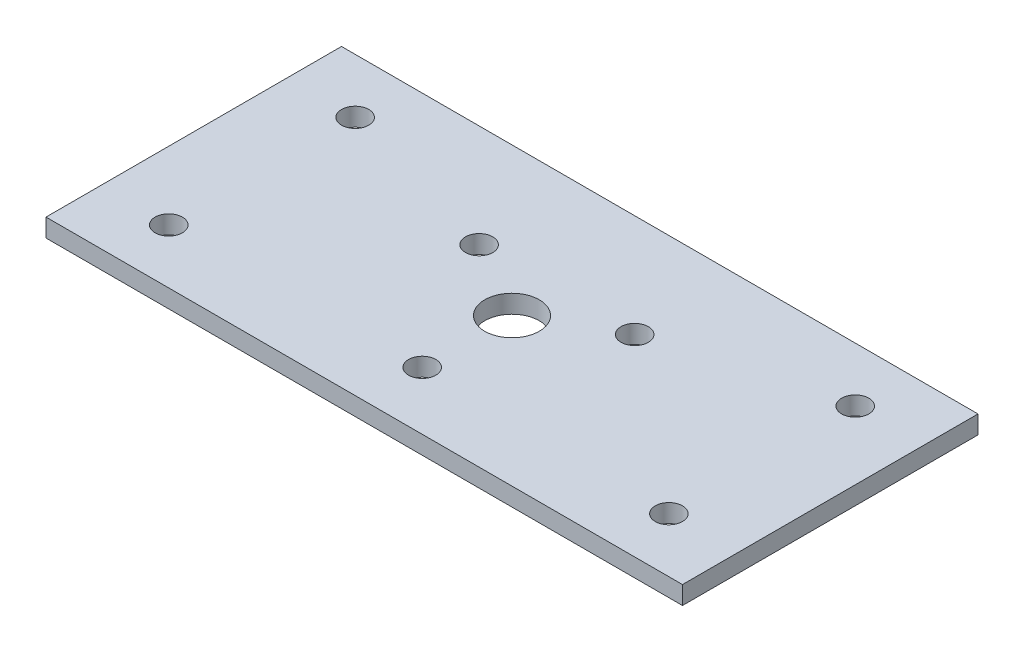
ISO-10303-21;
HEADER;
FILE_DESCRIPTION(('STEP AP214'),'2;1');
FILE_NAME('part.step','',(''),(''),'','','');
FILE_SCHEMA(('AUTOMOTIVE_DESIGN { 1 0 10303 214 1 1 1 1 }'));
ENDSEC;
DATA;
#1=APPLICATION_CONTEXT('core data for automotive mechanical design processes');
#2=APPLICATION_PROTOCOL_DEFINITION('international standard','automotive_design',2000,#1);
#3=PRODUCT_CONTEXT('',#1,'mechanical');
#4=PRODUCT('Part','Part','',(#3));
#5=PRODUCT_RELATED_PRODUCT_CATEGORY('part','',(#4));
#6=PRODUCT_DEFINITION_FORMATION('','',#4);
#7=PRODUCT_DEFINITION_CONTEXT('part definition',#1,'design');
#8=PRODUCT_DEFINITION('design','',#6,#7);
#9=PRODUCT_DEFINITION_SHAPE('','',#8);
#10=(LENGTH_UNIT() NAMED_UNIT(*) SI_UNIT(.MILLI.,.METRE.));
#11=(NAMED_UNIT(*) PLANE_ANGLE_UNIT() SI_UNIT($,.RADIAN.));
#12=(NAMED_UNIT(*) SI_UNIT($,.STERADIAN.) SOLID_ANGLE_UNIT());
#13=UNCERTAINTY_MEASURE_WITH_UNIT(LENGTH_MEASURE(1.E-05),#10,'distance_accuracy_value','');
#14=(GEOMETRIC_REPRESENTATION_CONTEXT(3) GLOBAL_UNCERTAINTY_ASSIGNED_CONTEXT((#13)) GLOBAL_UNIT_ASSIGNED_CONTEXT((#10,
#11,#12)) REPRESENTATION_CONTEXT('',''));
#15=CARTESIAN_POINT('',(0.,0.,0.));
#16=DIRECTION('',(0.,0.,1.));
#17=DIRECTION('',(1.,0.,0.));
#18=AXIS2_PLACEMENT_3D('',#15,#16,#17);
#19=CARTESIAN_POINT('',(0.,4.,0.));
#20=DIRECTION('',(0.,-1.,0.));
#21=DIRECTION('',(0.,0.,-1.));
#22=AXIS2_PLACEMENT_3D('',#19,#20,#21);
#23=PLANE('',#22);
#24=DIRECTION('',(0.,0.,-1.));
#25=VECTOR('',#24,1.);
#26=CARTESIAN_POINT('',(70.,4.,32.5));
#27=LINE('',#26,#25);
#28=CARTESIAN_POINT('',(70.,4.,32.5));
#29=VERTEX_POINT('',#28);
#30=CARTESIAN_POINT('',(70.,4.,-32.5));
#31=VERTEX_POINT('',#30);
#32=EDGE_CURVE('E90',#29,#31,#27,.T.);
#33=ORIENTED_EDGE('',*,*,#32,.T.);
#34=DIRECTION('',(-1.,0.,0.));
#35=VECTOR('',#34,1.);
#36=CARTESIAN_POINT('',(-70.,4.,-32.5));
#37=LINE('',#36,#35);
#38=CARTESIAN_POINT('',(-70.,4.,-32.5));
#39=VERTEX_POINT('',#38);
#40=EDGE_CURVE('E85',#31,#39,#37,.T.);
#41=ORIENTED_EDGE('',*,*,#40,.T.);
#42=DIRECTION('',(0.,0.,1.));
#43=VECTOR('',#42,1.);
#44=CARTESIAN_POINT('',(-70.,4.,32.5));
#45=LINE('',#44,#43);
#46=CARTESIAN_POINT('',(-70.,4.,32.5));
#47=VERTEX_POINT('',#46);
#48=EDGE_CURVE('E88',#39,#47,#45,.T.);
#49=ORIENTED_EDGE('',*,*,#48,.T.);
#50=DIRECTION('',(1.,0.,0.));
#51=VECTOR('',#50,1.);
#52=CARTESIAN_POINT('',(-70.,4.,32.5));
#53=LINE('',#52,#51);
#54=EDGE_CURVE('E55',#47,#29,#53,.T.);
#55=ORIENTED_EDGE('',*,*,#54,.T.);
#56=EDGE_LOOP('',(#33,#41,#49,#55));
#57=FACE_BOUND('',#56,.T.);
#58=CARTESIAN_POINT('',(0.,4.,0.));
#59=DIRECTION('',(0.,1.,0.));
#60=DIRECTION('',(0.,0.,1.));
#61=AXIS2_PLACEMENT_3D('',#58,#59,#60);
#62=CIRCLE('',#61,6.);
#63=CARTESIAN_POINT('',(0.,4.,6.00000000000001));
#64=VERTEX_POINT('',#63);
#65=EDGE_CURVE('E105',#64,#64,#62,.T.);
#66=ORIENTED_EDGE('',*,*,#65,.F.);
#67=EDGE_LOOP('',(#66));
#68=FACE_BOUND('',#67,.T.);
#69=CARTESIAN_POINT('',(0.,4.,19.75));
#70=DIRECTION('',(0.,1.,0.));
#71=DIRECTION('',(0.,0.,1.));
#72=AXIS2_PLACEMENT_3D('',#69,#70,#71);
#73=CIRCLE('',#72,3.);
#74=CARTESIAN_POINT('',(0.,4.,22.75));
#75=VERTEX_POINT('',#74);
#76=EDGE_CURVE('E120',#75,#75,#73,.T.);
#77=ORIENTED_EDGE('',*,*,#76,.F.);
#78=EDGE_LOOP('',(#77));
#79=FACE_BOUND('',#78,.T.);
#80=CARTESIAN_POINT('',(-55.,4.,20.5));
#81=DIRECTION('',(0.,1.,0.));
#82=DIRECTION('',(0.,0.,1.));
#83=AXIS2_PLACEMENT_3D('',#80,#81,#82);
#84=CIRCLE('',#83,3.);
#85=CARTESIAN_POINT('',(-55.,4.,23.5));
#86=VERTEX_POINT('',#85);
#87=EDGE_CURVE('E126',#86,#86,#84,.T.);
#88=ORIENTED_EDGE('',*,*,#87,.F.);
#89=EDGE_LOOP('',(#88));
#90=FACE_BOUND('',#89,.T.);
#91=CARTESIAN_POINT('',(-17.1040017247427,4.,-9.875));
#92=DIRECTION('',(0.,1.,0.));
#93=DIRECTION('',(0.,0.,1.));
#94=AXIS2_PLACEMENT_3D('',#91,#92,#93);
#95=CIRCLE('',#94,3.);
#96=CARTESIAN_POINT('',(-17.1040017247427,4.,-6.875));
#97=VERTEX_POINT('',#96);
#98=EDGE_CURVE('E132',#97,#97,#95,.T.);
#99=ORIENTED_EDGE('',*,*,#98,.F.);
#100=EDGE_LOOP('',(#99));
#101=FACE_BOUND('',#100,.T.);
#102=CARTESIAN_POINT('',(17.1040017247427,4.,-9.87500000000001));
#103=DIRECTION('',(0.,1.,0.));
#104=DIRECTION('',(0.,0.,1.));
#105=AXIS2_PLACEMENT_3D('',#102,#103,#104);
#106=CIRCLE('',#105,3.);
#107=CARTESIAN_POINT('',(17.1040017247427,4.,-6.87500000000001));
#108=VERTEX_POINT('',#107);
#109=EDGE_CURVE('E138',#108,#108,#106,.T.);
#110=ORIENTED_EDGE('',*,*,#109,.F.);
#111=EDGE_LOOP('',(#110));
#112=FACE_BOUND('',#111,.T.);
#113=CARTESIAN_POINT('',(-55.,4.,-20.5));
#114=DIRECTION('',(0.,1.,0.));
#115=DIRECTION('',(0.,0.,1.));
#116=AXIS2_PLACEMENT_3D('',#113,#114,#115);
#117=CIRCLE('',#116,3.);
#118=CARTESIAN_POINT('',(-55.,4.,-17.5));
#119=VERTEX_POINT('',#118);
#120=EDGE_CURVE('E144',#119,#119,#117,.T.);
#121=ORIENTED_EDGE('',*,*,#120,.F.);
#122=EDGE_LOOP('',(#121));
#123=FACE_BOUND('',#122,.T.);
#124=CARTESIAN_POINT('',(55.,4.,-20.5));
#125=DIRECTION('',(0.,1.,0.));
#126=DIRECTION('',(0.,0.,1.));
#127=AXIS2_PLACEMENT_3D('',#124,#125,#126);
#128=CIRCLE('',#127,3.00000000000001);
#129=CARTESIAN_POINT('',(55.,4.,-17.5));
#130=VERTEX_POINT('',#129);
#131=EDGE_CURVE('E150',#130,#130,#128,.T.);
#132=ORIENTED_EDGE('',*,*,#131,.F.);
#133=EDGE_LOOP('',(#132));
#134=FACE_BOUND('',#133,.T.);
#135=CARTESIAN_POINT('',(55.,4.,20.5));
#136=DIRECTION('',(0.,1.,0.));
#137=DIRECTION('',(0.,0.,1.));
#138=AXIS2_PLACEMENT_3D('',#135,#136,#137);
#139=CIRCLE('',#138,3.00000000000001);
#140=CARTESIAN_POINT('',(55.,4.,23.5));
#141=VERTEX_POINT('',#140);
#142=EDGE_CURVE('E156',#141,#141,#139,.T.);
#143=ORIENTED_EDGE('',*,*,#142,.F.);
#144=EDGE_LOOP('',(#143));
#145=FACE_BOUND('',#144,.T.);
#146=ADVANCED_FACE('F38',(#57,#68,#79,#90,#101,#112,#123,#134,#145),#23,.F.);
#147=CARTESIAN_POINT('',(0.,0.,0.));
#148=DIRECTION('',(0.,-1.,0.));
#149=DIRECTION('',(0.,0.,-1.));
#150=AXIS2_PLACEMENT_3D('',#147,#148,#149);
#151=PLANE('',#150);
#152=CARTESIAN_POINT('',(55.,0.,-20.5));
#153=DIRECTION('',(0.,1.,0.));
#154=DIRECTION('',(0.,0.,1.));
#155=AXIS2_PLACEMENT_3D('',#152,#153,#154);
#156=CIRCLE('',#155,3.00000000000001);
#157=CARTESIAN_POINT('',(55.,0.,-17.5));
#158=VERTEX_POINT('',#157);
#159=EDGE_CURVE('E153',#158,#158,#156,.T.);
#160=ORIENTED_EDGE('',*,*,#159,.T.);
#161=EDGE_LOOP('',(#160));
#162=FACE_BOUND('',#161,.T.);
#163=CARTESIAN_POINT('',(17.1040017247427,0.,-9.87500000000001));
#164=DIRECTION('',(0.,1.,0.));
#165=DIRECTION('',(0.,0.,1.));
#166=AXIS2_PLACEMENT_3D('',#163,#164,#165);
#167=CIRCLE('',#166,3.);
#168=CARTESIAN_POINT('',(17.1040017247427,0.,-6.87500000000001));
#169=VERTEX_POINT('',#168);
#170=EDGE_CURVE('E141',#169,#169,#167,.T.);
#171=ORIENTED_EDGE('',*,*,#170,.T.);
#172=EDGE_LOOP('',(#171));
#173=FACE_BOUND('',#172,.T.);
#174=CARTESIAN_POINT('',(-55.,0.,20.5));
#175=DIRECTION('',(0.,1.,0.));
#176=DIRECTION('',(0.,0.,1.));
#177=AXIS2_PLACEMENT_3D('',#174,#175,#176);
#178=CIRCLE('',#177,3.);
#179=CARTESIAN_POINT('',(-55.,0.,23.5));
#180=VERTEX_POINT('',#179);
#181=EDGE_CURVE('E129',#180,#180,#178,.T.);
#182=ORIENTED_EDGE('',*,*,#181,.T.);
#183=EDGE_LOOP('',(#182));
#184=FACE_BOUND('',#183,.T.);
#185=CARTESIAN_POINT('',(0.,0.,0.));
#186=DIRECTION('',(0.,1.,0.));
#187=DIRECTION('',(0.,0.,1.));
#188=AXIS2_PLACEMENT_3D('',#185,#186,#187);
#189=CIRCLE('',#188,6.);
#190=CARTESIAN_POINT('',(0.,0.,6.00000000000001));
#191=VERTEX_POINT('',#190);
#192=EDGE_CURVE('E117',#191,#191,#189,.T.);
#193=ORIENTED_EDGE('',*,*,#192,.T.);
#194=EDGE_LOOP('',(#193));
#195=FACE_BOUND('',#194,.T.);
#196=DIRECTION('',(0.,0.,-1.));
#197=VECTOR('',#196,1.);
#198=CARTESIAN_POINT('',(70.,0.,32.5));
#199=LINE('',#198,#197);
#200=CARTESIAN_POINT('',(70.,0.,32.5));
#201=VERTEX_POINT('',#200);
#202=CARTESIAN_POINT('',(70.,0.,-32.5));
#203=VERTEX_POINT('',#202);
#204=EDGE_CURVE('E102',#201,#203,#199,.T.);
#205=ORIENTED_EDGE('',*,*,#204,.F.);
#206=DIRECTION('',(1.,0.,0.));
#207=VECTOR('',#206,1.);
#208=CARTESIAN_POINT('',(-70.,0.,32.5));
#209=LINE('',#208,#207);
#210=CARTESIAN_POINT('',(-70.,0.,32.5));
#211=VERTEX_POINT('',#210);
#212=EDGE_CURVE('E78',#211,#201,#209,.T.);
#213=ORIENTED_EDGE('',*,*,#212,.F.);
#214=DIRECTION('',(0.,0.,1.));
#215=VECTOR('',#214,1.);
#216=CARTESIAN_POINT('',(-70.,0.,32.5));
#217=LINE('',#216,#215);
#218=CARTESIAN_POINT('',(-70.,0.,-32.5));
#219=VERTEX_POINT('',#218);
#220=EDGE_CURVE('E72',#219,#211,#217,.T.);
#221=ORIENTED_EDGE('',*,*,#220,.F.);
#222=DIRECTION('',(-1.,0.,0.));
#223=VECTOR('',#222,1.);
#224=CARTESIAN_POINT('',(-70.,0.,-32.5));
#225=LINE('',#224,#223);
#226=EDGE_CURVE('E94',#203,#219,#225,.T.);
#227=ORIENTED_EDGE('',*,*,#226,.F.);
#228=EDGE_LOOP('',(#205,#213,#221,#227));
#229=FACE_BOUND('',#228,.T.);
#230=CARTESIAN_POINT('',(0.,0.,19.75));
#231=DIRECTION('',(0.,1.,0.));
#232=DIRECTION('',(0.,0.,1.));
#233=AXIS2_PLACEMENT_3D('',#230,#231,#232);
#234=CIRCLE('',#233,3.);
#235=CARTESIAN_POINT('',(0.,0.,22.75));
#236=VERTEX_POINT('',#235);
#237=EDGE_CURVE('E123',#236,#236,#234,.T.);
#238=ORIENTED_EDGE('',*,*,#237,.T.);
#239=EDGE_LOOP('',(#238));
#240=FACE_BOUND('',#239,.T.);
#241=CARTESIAN_POINT('',(-17.1040017247427,0.,-9.875));
#242=DIRECTION('',(0.,1.,0.));
#243=DIRECTION('',(0.,0.,1.));
#244=AXIS2_PLACEMENT_3D('',#241,#242,#243);
#245=CIRCLE('',#244,3.);
#246=CARTESIAN_POINT('',(-17.1040017247427,0.,-6.875));
#247=VERTEX_POINT('',#246);
#248=EDGE_CURVE('E135',#247,#247,#245,.T.);
#249=ORIENTED_EDGE('',*,*,#248,.T.);
#250=EDGE_LOOP('',(#249));
#251=FACE_BOUND('',#250,.T.);
#252=CARTESIAN_POINT('',(-55.,0.,-20.5));
#253=DIRECTION('',(0.,1.,0.));
#254=DIRECTION('',(0.,0.,1.));
#255=AXIS2_PLACEMENT_3D('',#252,#253,#254);
#256=CIRCLE('',#255,3.);
#257=CARTESIAN_POINT('',(-55.,0.,-17.5));
#258=VERTEX_POINT('',#257);
#259=EDGE_CURVE('E147',#258,#258,#256,.T.);
#260=ORIENTED_EDGE('',*,*,#259,.T.);
#261=EDGE_LOOP('',(#260));
#262=FACE_BOUND('',#261,.T.);
#263=CARTESIAN_POINT('',(55.,0.,20.5));
#264=DIRECTION('',(0.,1.,0.));
#265=DIRECTION('',(0.,0.,1.));
#266=AXIS2_PLACEMENT_3D('',#263,#264,#265);
#267=CIRCLE('',#266,3.00000000000001);
#268=CARTESIAN_POINT('',(55.,0.,23.5));
#269=VERTEX_POINT('',#268);
#270=EDGE_CURVE('E159',#269,#269,#267,.T.);
#271=ORIENTED_EDGE('',*,*,#270,.T.);
#272=EDGE_LOOP('',(#271));
#273=FACE_BOUND('',#272,.T.);
#274=ADVANCED_FACE('F113',(#162,#173,#184,#195,#229,#240,#251,#262,#273),#151,.T.);
#275=CARTESIAN_POINT('',(70.,4.,32.5));
#276=DIRECTION('',(-1.,0.,0.));
#277=DIRECTION('',(0.,0.,1.));
#278=AXIS2_PLACEMENT_3D('',#275,#276,#277);
#279=PLANE('',#278);
#280=ORIENTED_EDGE('',*,*,#204,.T.);
#281=DIRECTION('',(0.,-1.,0.));
#282=VECTOR('',#281,1.);
#283=CARTESIAN_POINT('',(70.,4.,-32.5));
#284=LINE('',#283,#282);
#285=EDGE_CURVE('E11',#31,#203,#284,.T.);
#286=ORIENTED_EDGE('',*,*,#285,.F.);
#287=ORIENTED_EDGE('',*,*,#32,.F.);
#288=DIRECTION('',(0.,-1.,0.));
#289=VECTOR('',#288,1.);
#290=CARTESIAN_POINT('',(70.,4.,32.5));
#291=LINE('',#290,#289);
#292=EDGE_CURVE('E98',#29,#201,#291,.T.);
#293=ORIENTED_EDGE('',*,*,#292,.T.);
#294=EDGE_LOOP('',(#280,#286,#287,#293));
#295=FACE_BOUND('',#294,.T.);
#296=ADVANCED_FACE('F40',(#295),#279,.F.);
#297=CARTESIAN_POINT('',(-70.,4.,-32.5));
#298=DIRECTION('',(0.,0.,1.));
#299=DIRECTION('',(1.,0.,0.));
#300=AXIS2_PLACEMENT_3D('',#297,#298,#299);
#301=PLANE('',#300);
#302=ORIENTED_EDGE('',*,*,#226,.T.);
#303=DIRECTION('',(0.,-1.,0.));
#304=VECTOR('',#303,1.);
#305=CARTESIAN_POINT('',(-70.,4.,-32.5));
#306=LINE('',#305,#304);
#307=EDGE_CURVE('E47',#39,#219,#306,.T.);
#308=ORIENTED_EDGE('',*,*,#307,.F.);
#309=ORIENTED_EDGE('',*,*,#40,.F.);
#310=ORIENTED_EDGE('',*,*,#285,.T.);
#311=EDGE_LOOP('',(#302,#308,#309,#310));
#312=FACE_BOUND('',#311,.T.);
#313=ADVANCED_FACE('F93',(#312),#301,.F.);
#314=CARTESIAN_POINT('',(-70.,4.,32.5));
#315=DIRECTION('',(1.,0.,0.));
#316=DIRECTION('',(0.,0.,-1.));
#317=AXIS2_PLACEMENT_3D('',#314,#315,#316);
#318=PLANE('',#317);
#319=ORIENTED_EDGE('',*,*,#220,.T.);
#320=DIRECTION('',(0.,-1.,0.));
#321=VECTOR('',#320,1.);
#322=CARTESIAN_POINT('',(-70.,4.,32.5));
#323=LINE('',#322,#321);
#324=EDGE_CURVE('E95',#47,#211,#323,.T.);
#325=ORIENTED_EDGE('',*,*,#324,.F.);
#326=ORIENTED_EDGE('',*,*,#48,.F.);
#327=ORIENTED_EDGE('',*,*,#307,.T.);
#328=EDGE_LOOP('',(#319,#325,#326,#327));
#329=FACE_BOUND('',#328,.T.);
#330=ADVANCED_FACE('F96',(#329),#318,.F.);
#331=CARTESIAN_POINT('',(-70.,4.,32.5));
#332=DIRECTION('',(0.,0.,-1.));
#333=DIRECTION('',(-1.,0.,0.));
#334=AXIS2_PLACEMENT_3D('',#331,#332,#333);
#335=PLANE('',#334);
#336=ORIENTED_EDGE('',*,*,#212,.T.);
#337=ORIENTED_EDGE('',*,*,#292,.F.);
#338=ORIENTED_EDGE('',*,*,#54,.F.);
#339=ORIENTED_EDGE('',*,*,#324,.T.);
#340=EDGE_LOOP('',(#336,#337,#338,#339));
#341=FACE_BOUND('',#340,.T.);
#342=ADVANCED_FACE('F110',(#341),#335,.F.);
#343=CARTESIAN_POINT('',(0.,4.,0.));
#344=DIRECTION('',(0.,-1.,0.));
#345=DIRECTION('',(0.,0.,-1.));
#346=AXIS2_PLACEMENT_3D('',#343,#344,#345);
#347=CYLINDRICAL_SURFACE('',#346,6.);
#348=ORIENTED_EDGE('',*,*,#65,.T.);
#349=EDGE_LOOP('',(#348));
#350=FACE_BOUND('',#349,.T.);
#351=ORIENTED_EDGE('',*,*,#192,.F.);
#352=EDGE_LOOP('',(#351));
#353=FACE_BOUND('',#352,.T.);
#354=ADVANCED_FACE('F176',(#350,#353),#347,.F.);
#355=CARTESIAN_POINT('',(0.,4.,19.75));
#356=DIRECTION('',(0.,-1.,0.));
#357=DIRECTION('',(0.,0.,-1.));
#358=AXIS2_PLACEMENT_3D('',#355,#356,#357);
#359=CYLINDRICAL_SURFACE('',#358,3.);
#360=ORIENTED_EDGE('',*,*,#76,.T.);
#361=EDGE_LOOP('',(#360));
#362=FACE_BOUND('',#361,.T.);
#363=ORIENTED_EDGE('',*,*,#237,.F.);
#364=EDGE_LOOP('',(#363));
#365=FACE_BOUND('',#364,.T.);
#366=ADVANCED_FACE('F230',(#362,#365),#359,.F.);
#367=CARTESIAN_POINT('',(-55.,4.,20.5));
#368=DIRECTION('',(0.,-1.,0.));
#369=DIRECTION('',(0.,0.,-1.));
#370=AXIS2_PLACEMENT_3D('',#367,#368,#369);
#371=CYLINDRICAL_SURFACE('',#370,3.);
#372=ORIENTED_EDGE('',*,*,#87,.T.);
#373=EDGE_LOOP('',(#372));
#374=FACE_BOUND('',#373,.T.);
#375=ORIENTED_EDGE('',*,*,#181,.F.);
#376=EDGE_LOOP('',(#375));
#377=FACE_BOUND('',#376,.T.);
#378=ADVANCED_FACE('F239',(#374,#377),#371,.F.);
#379=CARTESIAN_POINT('',(-17.1040017247427,4.,-9.875));
#380=DIRECTION('',(0.,-1.,0.));
#381=DIRECTION('',(0.,0.,-1.));
#382=AXIS2_PLACEMENT_3D('',#379,#380,#381);
#383=CYLINDRICAL_SURFACE('',#382,3.);
#384=ORIENTED_EDGE('',*,*,#98,.T.);
#385=EDGE_LOOP('',(#384));
#386=FACE_BOUND('',#385,.T.);
#387=ORIENTED_EDGE('',*,*,#248,.F.);
#388=EDGE_LOOP('',(#387));
#389=FACE_BOUND('',#388,.T.);
#390=ADVANCED_FACE('F248',(#386,#389),#383,.F.);
#391=CARTESIAN_POINT('',(17.1040017247427,4.,-9.87500000000001));
#392=DIRECTION('',(0.,-1.,0.));
#393=DIRECTION('',(0.,0.,-1.));
#394=AXIS2_PLACEMENT_3D('',#391,#392,#393);
#395=CYLINDRICAL_SURFACE('',#394,3.);
#396=ORIENTED_EDGE('',*,*,#109,.T.);
#397=EDGE_LOOP('',(#396));
#398=FACE_BOUND('',#397,.T.);
#399=ORIENTED_EDGE('',*,*,#170,.F.);
#400=EDGE_LOOP('',(#399));
#401=FACE_BOUND('',#400,.T.);
#402=ADVANCED_FACE('F258',(#398,#401),#395,.F.);
#403=CARTESIAN_POINT('',(-55.,4.,-20.5));
#404=DIRECTION('',(0.,-1.,0.));
#405=DIRECTION('',(0.,0.,-1.));
#406=AXIS2_PLACEMENT_3D('',#403,#404,#405);
#407=CYLINDRICAL_SURFACE('',#406,3.);
#408=ORIENTED_EDGE('',*,*,#120,.T.);
#409=EDGE_LOOP('',(#408));
#410=FACE_BOUND('',#409,.T.);
#411=ORIENTED_EDGE('',*,*,#259,.F.);
#412=EDGE_LOOP('',(#411));
#413=FACE_BOUND('',#412,.T.);
#414=ADVANCED_FACE('F268',(#410,#413),#407,.F.);
#415=CARTESIAN_POINT('',(55.,4.,-20.5));
#416=DIRECTION('',(0.,-1.,0.));
#417=DIRECTION('',(0.,0.,-1.));
#418=AXIS2_PLACEMENT_3D('',#415,#416,#417);
#419=CYLINDRICAL_SURFACE('',#418,3.00000000000001);
#420=ORIENTED_EDGE('',*,*,#131,.T.);
#421=EDGE_LOOP('',(#420));
#422=FACE_BOUND('',#421,.T.);
#423=ORIENTED_EDGE('',*,*,#159,.F.);
#424=EDGE_LOOP('',(#423));
#425=FACE_BOUND('',#424,.T.);
#426=ADVANCED_FACE('F278',(#422,#425),#419,.F.);
#427=CARTESIAN_POINT('',(55.,4.,20.5));
#428=DIRECTION('',(0.,-1.,0.));
#429=DIRECTION('',(0.,0.,-1.));
#430=AXIS2_PLACEMENT_3D('',#427,#428,#429);
#431=CYLINDRICAL_SURFACE('',#430,3.00000000000001);
#432=ORIENTED_EDGE('',*,*,#142,.T.);
#433=EDGE_LOOP('',(#432));
#434=FACE_BOUND('',#433,.T.);
#435=ORIENTED_EDGE('',*,*,#270,.F.);
#436=EDGE_LOOP('',(#435));
#437=FACE_BOUND('',#436,.T.);
#438=ADVANCED_FACE('F165',(#434,#437),#431,.F.);
#439=CLOSED_SHELL('',(#146,#274,#296,#313,#330,#342,#354,#366,#378,#390,#402,#414,#426,#438));
#440=MANIFOLD_SOLID_BREP('B2',#439);
#441=ADVANCED_BREP_SHAPE_REPRESENTATION('',(#18,#440),#14);
#442=SHAPE_DEFINITION_REPRESENTATION(#9,#441);
ENDSEC;
END-ISO-10303-21;
